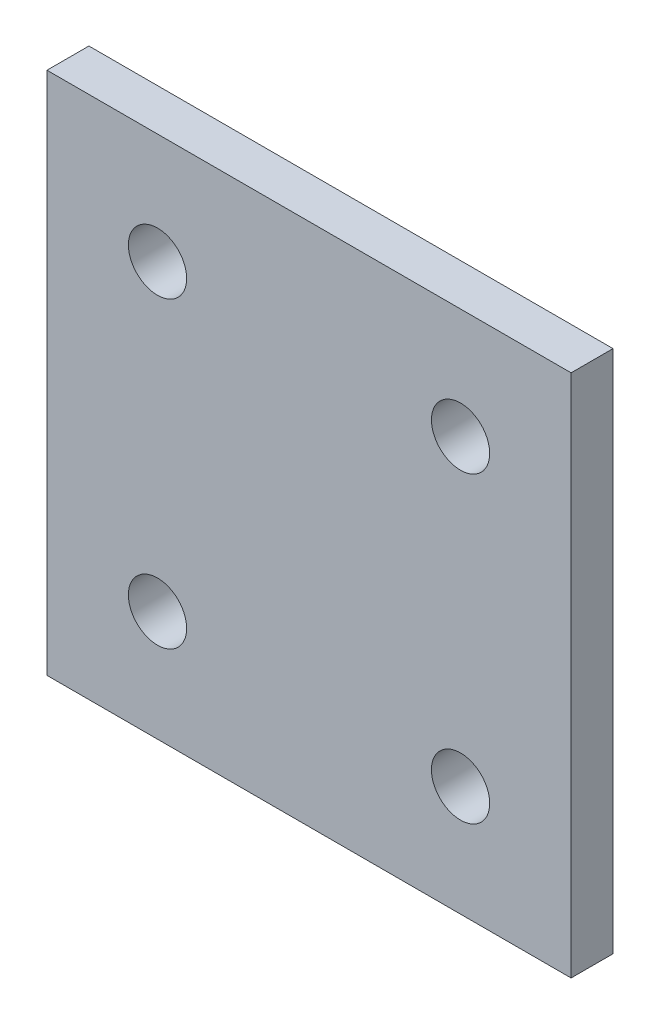
ISO-10303-21;
HEADER;
FILE_DESCRIPTION(('STEP AP214'),'2;1');
FILE_NAME('part.step','',(''),(''),'','','');
FILE_SCHEMA(('AUTOMOTIVE_DESIGN { 1 0 10303 214 1 1 1 1 }'));
ENDSEC;
DATA;
#1=APPLICATION_CONTEXT('core data for automotive mechanical design processes');
#2=APPLICATION_PROTOCOL_DEFINITION('international standard','automotive_design',2000,#1);
#3=PRODUCT_CONTEXT('',#1,'mechanical');
#4=PRODUCT('Part','Part','',(#3));
#5=PRODUCT_RELATED_PRODUCT_CATEGORY('part','',(#4));
#6=PRODUCT_DEFINITION_FORMATION('','',#4);
#7=PRODUCT_DEFINITION_CONTEXT('part definition',#1,'design');
#8=PRODUCT_DEFINITION('design','',#6,#7);
#9=PRODUCT_DEFINITION_SHAPE('','',#8);
#10=(LENGTH_UNIT() NAMED_UNIT(*) SI_UNIT(.MILLI.,.METRE.));
#11=(NAMED_UNIT(*) PLANE_ANGLE_UNIT() SI_UNIT($,.RADIAN.));
#12=(NAMED_UNIT(*) SI_UNIT($,.STERADIAN.) SOLID_ANGLE_UNIT());
#13=UNCERTAINTY_MEASURE_WITH_UNIT(LENGTH_MEASURE(1.E-05),#10,'distance_accuracy_value','');
#14=(GEOMETRIC_REPRESENTATION_CONTEXT(3) GLOBAL_UNCERTAINTY_ASSIGNED_CONTEXT((#13)) GLOBAL_UNIT_ASSIGNED_CONTEXT((#10,
#11,#12)) REPRESENTATION_CONTEXT('',''));
#15=CARTESIAN_POINT('',(0.,0.,0.));
#16=DIRECTION('',(0.,0.,1.));
#17=DIRECTION('',(1.,0.,0.));
#18=AXIS2_PLACEMENT_3D('',#15,#16,#17);
#19=CARTESIAN_POINT('',(0.,0.,0.));
#20=DIRECTION('',(0.,0.,-1.));
#21=DIRECTION('',(-1.,0.,0.));
#22=AXIS2_PLACEMENT_3D('',#19,#20,#21);
#23=PLANE('',#22);
#24=CARTESIAN_POINT('',(16.5221018480518,-16.5221018480521,0.));
#25=DIRECTION('',(0.,0.,1.));
#26=DIRECTION('',(1.,0.,0.));
#27=AXIS2_PLACEMENT_3D('',#24,#25,#26);
#28=CIRCLE('',#27,3.175);
#29=CARTESIAN_POINT('',(19.6971018480518,-16.5221018480521,0.));
#30=VERTEX_POINT('',#29);
#31=EDGE_CURVE('E175',#30,#30,#28,.T.);
#32=ORIENTED_EDGE('',*,*,#31,.T.);
#33=EDGE_LOOP('',(#32));
#34=FACE_BOUND('',#33,.T.);
#35=CARTESIAN_POINT('',(0.,0.,0.));
#36=DIRECTION('',(0.,0.,1.));
#37=DIRECTION('',(1.,0.,0.));
#38=AXIS2_PLACEMENT_3D('',#35,#36,#37);
#39=CIRCLE('',#38,11.3);
#40=CARTESIAN_POINT('',(11.3,0.,0.));
#41=VERTEX_POINT('',#40);
#42=EDGE_CURVE('E181',#41,#41,#39,.T.);
#43=ORIENTED_EDGE('',*,*,#42,.T.);
#44=EDGE_LOOP('',(#43));
#45=FACE_BOUND('',#44,.T.);
#46=DIRECTION('',(0.,1.,0.));
#47=VECTOR('',#46,1.);
#48=CARTESIAN_POINT('',(28.575,-28.575,0.));
#49=LINE('',#48,#47);
#50=CARTESIAN_POINT('',(28.575,-28.575,0.));
#51=VERTEX_POINT('',#50);
#52=CARTESIAN_POINT('',(28.575,28.575,0.));
#53=VERTEX_POINT('',#52);
#54=EDGE_CURVE('E189',#51,#53,#49,.T.);
#55=ORIENTED_EDGE('',*,*,#54,.F.);
#56=DIRECTION('',(1.,0.,0.));
#57=VECTOR('',#56,1.);
#58=CARTESIAN_POINT('',(-28.575,-28.575,0.));
#59=LINE('',#58,#57);
#60=CARTESIAN_POINT('',(-28.575,-28.575,0.));
#61=VERTEX_POINT('',#60);
#62=EDGE_CURVE('E118',#61,#51,#59,.T.);
#63=ORIENTED_EDGE('',*,*,#62,.F.);
#64=DIRECTION('',(0.,-1.,0.));
#65=VECTOR('',#64,1.);
#66=CARTESIAN_POINT('',(-28.575,-28.575,0.));
#67=LINE('',#66,#65);
#68=CARTESIAN_POINT('',(-28.575,28.575,0.));
#69=VERTEX_POINT('',#68);
#70=EDGE_CURVE('E126',#69,#61,#67,.T.);
#71=ORIENTED_EDGE('',*,*,#70,.F.);
#72=DIRECTION('',(-1.,0.,0.));
#73=VECTOR('',#72,1.);
#74=CARTESIAN_POINT('',(-28.575,28.575,0.));
#75=LINE('',#74,#73);
#76=EDGE_CURVE('E147',#53,#69,#75,.T.);
#77=ORIENTED_EDGE('',*,*,#76,.F.);
#78=EDGE_LOOP('',(#55,#63,#71,#77));
#79=FACE_BOUND('',#78,.T.);
#80=CARTESIAN_POINT('',(-16.5221018480519,16.522101848052,0.));
#81=DIRECTION('',(0.,0.,1.));
#82=DIRECTION('',(1.,0.,0.));
#83=AXIS2_PLACEMENT_3D('',#80,#81,#82);
#84=CIRCLE('',#83,3.175);
#85=CARTESIAN_POINT('',(-13.3471018480519,16.522101848052,0.));
#86=VERTEX_POINT('',#85);
#87=EDGE_CURVE('E186',#86,#86,#84,.T.);
#88=ORIENTED_EDGE('',*,*,#87,.T.);
#89=EDGE_LOOP('',(#88));
#90=FACE_BOUND('',#89,.T.);
#91=CARTESIAN_POINT('',(16.522101848052,16.5221018480519,0.));
#92=DIRECTION('',(0.,0.,1.));
#93=DIRECTION('',(1.,0.,0.));
#94=AXIS2_PLACEMENT_3D('',#91,#92,#93);
#95=CIRCLE('',#94,3.175);
#96=CARTESIAN_POINT('',(19.697101848052,16.5221018480519,0.));
#97=VERTEX_POINT('',#96);
#98=EDGE_CURVE('E178',#97,#97,#95,.T.);
#99=ORIENTED_EDGE('',*,*,#98,.T.);
#100=EDGE_LOOP('',(#99));
#101=FACE_BOUND('',#100,.T.);
#102=CARTESIAN_POINT('',(-16.5221018480521,-16.5221018480517,0.));
#103=DIRECTION('',(0.,0.,1.));
#104=DIRECTION('',(1.,0.,0.));
#105=AXIS2_PLACEMENT_3D('',#102,#103,#104);
#106=CIRCLE('',#105,3.175);
#107=CARTESIAN_POINT('',(-13.3471018480521,-16.5221018480517,0.));
#108=VERTEX_POINT('',#107);
#109=EDGE_CURVE('E172',#108,#108,#106,.T.);
#110=ORIENTED_EDGE('',*,*,#109,.T.);
#111=EDGE_LOOP('',(#110));
#112=FACE_BOUND('',#111,.T.);
#113=ADVANCED_FACE('F103',(#34,#45,#79,#90,#101,#112),#23,.T.);
#114=CARTESIAN_POINT('',(28.575,-28.575,2.032));
#115=DIRECTION('',(-1.,0.,0.));
#116=DIRECTION('',(0.,0.,1.));
#117=AXIS2_PLACEMENT_3D('',#114,#115,#116);
#118=PLANE('',#117);
#119=ORIENTED_EDGE('',*,*,#54,.T.);
#120=DIRECTION('',(0.,0.,-1.));
#121=VECTOR('',#120,1.);
#122=CARTESIAN_POINT('',(28.575,28.575,2.032));
#123=LINE('',#122,#121);
#124=CARTESIAN_POINT('',(28.575,28.575,4.572));
#125=VERTEX_POINT('',#124);
#126=EDGE_CURVE('E12',#125,#53,#123,.T.);
#127=ORIENTED_EDGE('',*,*,#126,.F.);
#128=DIRECTION('',(0.,1.,0.));
#129=VECTOR('',#128,1.);
#130=CARTESIAN_POINT('',(28.575,0.,4.572));
#131=LINE('',#130,#129);
#132=CARTESIAN_POINT('',(28.575,-28.575,4.572));
#133=VERTEX_POINT('',#132);
#134=EDGE_CURVE('E157',#133,#125,#131,.T.);
#135=ORIENTED_EDGE('',*,*,#134,.F.);
#136=DIRECTION('',(0.,0.,-1.));
#137=VECTOR('',#136,1.);
#138=CARTESIAN_POINT('',(28.575,-28.575,2.032));
#139=LINE('',#138,#137);
#140=EDGE_CURVE('E195',#133,#51,#139,.T.);
#141=ORIENTED_EDGE('',*,*,#140,.T.);
#142=EDGE_LOOP('',(#119,#127,#135,#141));
#143=FACE_BOUND('',#142,.T.);
#144=ADVANCED_FACE('F105',(#143),#118,.F.);
#145=CARTESIAN_POINT('',(-28.575,28.575,2.032));
#146=DIRECTION('',(0.,-1.,0.));
#147=DIRECTION('',(0.,0.,-1.));
#148=AXIS2_PLACEMENT_3D('',#145,#146,#147);
#149=PLANE('',#148);
#150=ORIENTED_EDGE('',*,*,#76,.T.);
#151=DIRECTION('',(0.,0.,-1.));
#152=VECTOR('',#151,1.);
#153=CARTESIAN_POINT('',(-28.575,28.575,2.032));
#154=LINE('',#153,#152);
#155=CARTESIAN_POINT('',(-28.575,28.575,4.572));
#156=VERTEX_POINT('',#155);
#157=EDGE_CURVE('E111',#156,#69,#154,.T.);
#158=ORIENTED_EDGE('',*,*,#157,.F.);
#159=DIRECTION('',(1.,0.,0.));
#160=VECTOR('',#159,1.);
#161=CARTESIAN_POINT('',(0.,28.575,4.572));
#162=LINE('',#161,#160);
#163=EDGE_CURVE('E146',#156,#125,#162,.T.);
#164=ORIENTED_EDGE('',*,*,#163,.T.);
#165=ORIENTED_EDGE('',*,*,#126,.T.);
#166=EDGE_LOOP('',(#150,#158,#164,#165));
#167=FACE_BOUND('',#166,.T.);
#168=ADVANCED_FACE('F145',(#167),#149,.F.);
#169=CARTESIAN_POINT('',(-28.575,-28.575,2.032));
#170=DIRECTION('',(1.,0.,0.));
#171=DIRECTION('',(0.,0.,-1.));
#172=AXIS2_PLACEMENT_3D('',#169,#170,#171);
#173=PLANE('',#172);
#174=ORIENTED_EDGE('',*,*,#70,.T.);
#175=DIRECTION('',(0.,0.,-1.));
#176=VECTOR('',#175,1.);
#177=CARTESIAN_POINT('',(-28.575,-28.575,2.032));
#178=LINE('',#177,#176);
#179=CARTESIAN_POINT('',(-28.575,-28.575,4.572));
#180=VERTEX_POINT('',#179);
#181=EDGE_CURVE('E149',#180,#61,#178,.T.);
#182=ORIENTED_EDGE('',*,*,#181,.F.);
#183=DIRECTION('',(0.,1.,0.));
#184=VECTOR('',#183,1.);
#185=CARTESIAN_POINT('',(-28.575,0.,4.572));
#186=LINE('',#185,#184);
#187=EDGE_CURVE('E155',#180,#156,#186,.T.);
#188=ORIENTED_EDGE('',*,*,#187,.T.);
#189=ORIENTED_EDGE('',*,*,#157,.T.);
#190=EDGE_LOOP('',(#174,#182,#188,#189));
#191=FACE_BOUND('',#190,.T.);
#192=ADVANCED_FACE('F159',(#191),#173,.F.);
#193=CARTESIAN_POINT('',(-28.575,-28.575,2.032));
#194=DIRECTION('',(0.,1.,0.));
#195=DIRECTION('',(0.,0.,1.));
#196=AXIS2_PLACEMENT_3D('',#193,#194,#195);
#197=PLANE('',#196);
#198=ORIENTED_EDGE('',*,*,#62,.T.);
#199=ORIENTED_EDGE('',*,*,#140,.F.);
#200=DIRECTION('',(1.,0.,0.));
#201=VECTOR('',#200,1.);
#202=CARTESIAN_POINT('',(0.,-28.575,4.572));
#203=LINE('',#202,#201);
#204=EDGE_CURVE('E169',#180,#133,#203,.T.);
#205=ORIENTED_EDGE('',*,*,#204,.F.);
#206=ORIENTED_EDGE('',*,*,#181,.T.);
#207=EDGE_LOOP('',(#198,#199,#205,#206));
#208=FACE_BOUND('',#207,.T.);
#209=ADVANCED_FACE('F197',(#208),#197,.F.);
#210=CARTESIAN_POINT('',(-16.5221018480519,16.522101848052,2.032));
#211=DIRECTION('',(0.,0.,-1.));
#212=DIRECTION('',(-1.,0.,0.));
#213=AXIS2_PLACEMENT_3D('',#210,#211,#212);
#214=CYLINDRICAL_SURFACE('',#213,3.175);
#215=ORIENTED_EDGE('',*,*,#87,.F.);
#216=EDGE_LOOP('',(#215));
#217=FACE_BOUND('',#216,.T.);
#218=CARTESIAN_POINT('',(-16.5221018480519,16.522101848052,4.572));
#219=DIRECTION('',(0.,0.,-1.));
#220=DIRECTION('',(-1.,0.,0.));
#221=AXIS2_PLACEMENT_3D('',#218,#219,#220);
#222=CIRCLE('',#221,3.175);
#223=CARTESIAN_POINT('',(-19.6971018480519,16.522101848052,4.572));
#224=VERTEX_POINT('',#223);
#225=EDGE_CURVE('E161',#224,#224,#222,.T.);
#226=ORIENTED_EDGE('',*,*,#225,.F.);
#227=EDGE_LOOP('',(#226));
#228=FACE_BOUND('',#227,.T.);
#229=ADVANCED_FACE('F215',(#217,#228),#214,.F.);
#230=CARTESIAN_POINT('',(0.,0.,2.032));
#231=DIRECTION('',(0.,0.,-1.));
#232=DIRECTION('',(-1.,0.,0.));
#233=AXIS2_PLACEMENT_3D('',#230,#231,#232);
#234=CYLINDRICAL_SURFACE('',#233,11.3);
#235=CARTESIAN_POINT('',(0.,0.,2.032));
#236=DIRECTION('',(0.,0.,1.));
#237=DIRECTION('',(1.,0.,0.));
#238=AXIS2_PLACEMENT_3D('',#235,#236,#237);
#239=CIRCLE('',#238,11.3);
#240=CARTESIAN_POINT('',(11.3,0.,2.032));
#241=VERTEX_POINT('',#240);
#242=EDGE_CURVE('E171',#241,#241,#239,.T.);
#243=ORIENTED_EDGE('',*,*,#242,.T.);
#244=EDGE_LOOP('',(#243));
#245=FACE_BOUND('',#244,.T.);
#246=ORIENTED_EDGE('',*,*,#42,.F.);
#247=EDGE_LOOP('',(#246));
#248=FACE_BOUND('',#247,.T.);
#249=ADVANCED_FACE('F236',(#245,#248),#234,.F.);
#250=CARTESIAN_POINT('',(16.522101848052,16.5221018480519,2.032));
#251=DIRECTION('',(0.,0.,-1.));
#252=DIRECTION('',(-1.,0.,0.));
#253=AXIS2_PLACEMENT_3D('',#250,#251,#252);
#254=CYLINDRICAL_SURFACE('',#253,3.175);
#255=ORIENTED_EDGE('',*,*,#98,.F.);
#256=EDGE_LOOP('',(#255));
#257=FACE_BOUND('',#256,.T.);
#258=CARTESIAN_POINT('',(16.522101848052,16.5221018480519,4.572));
#259=DIRECTION('',(0.,0.,-1.));
#260=DIRECTION('',(-1.,0.,0.));
#261=AXIS2_PLACEMENT_3D('',#258,#259,#260);
#262=CIRCLE('',#261,3.175);
#263=CARTESIAN_POINT('',(13.347101848052,16.5221018480519,4.572));
#264=VERTEX_POINT('',#263);
#265=EDGE_CURVE('E164',#264,#264,#262,.T.);
#266=ORIENTED_EDGE('',*,*,#265,.F.);
#267=EDGE_LOOP('',(#266));
#268=FACE_BOUND('',#267,.T.);
#269=ADVANCED_FACE('F242',(#257,#268),#254,.F.);
#270=CARTESIAN_POINT('',(16.5221018480518,-16.5221018480521,2.032));
#271=DIRECTION('',(0.,0.,-1.));
#272=DIRECTION('',(-1.,0.,0.));
#273=AXIS2_PLACEMENT_3D('',#270,#271,#272);
#274=CYLINDRICAL_SURFACE('',#273,3.175);
#275=ORIENTED_EDGE('',*,*,#31,.F.);
#276=EDGE_LOOP('',(#275));
#277=FACE_BOUND('',#276,.T.);
#278=CARTESIAN_POINT('',(16.5221018480518,-16.5221018480521,4.572));
#279=DIRECTION('',(0.,0.,-1.));
#280=DIRECTION('',(-1.,0.,0.));
#281=AXIS2_PLACEMENT_3D('',#278,#279,#280);
#282=CIRCLE('',#281,3.175);
#283=CARTESIAN_POINT('',(13.3471018480518,-16.5221018480521,4.572));
#284=VERTEX_POINT('',#283);
#285=EDGE_CURVE('E345',#284,#284,#282,.T.);
#286=ORIENTED_EDGE('',*,*,#285,.F.);
#287=EDGE_LOOP('',(#286));
#288=FACE_BOUND('',#287,.T.);
#289=ADVANCED_FACE('F245',(#277,#288),#274,.F.);
#290=CARTESIAN_POINT('',(-16.5221018480521,-16.5221018480517,2.032));
#291=DIRECTION('',(0.,0.,-1.));
#292=DIRECTION('',(-1.,0.,0.));
#293=AXIS2_PLACEMENT_3D('',#290,#291,#292);
#294=CYLINDRICAL_SURFACE('',#293,3.175);
#295=ORIENTED_EDGE('',*,*,#109,.F.);
#296=EDGE_LOOP('',(#295));
#297=FACE_BOUND('',#296,.T.);
#298=CARTESIAN_POINT('',(-16.5221018480521,-16.5221018480517,4.572));
#299=DIRECTION('',(0.,0.,-1.));
#300=DIRECTION('',(-1.,0.,0.));
#301=AXIS2_PLACEMENT_3D('',#298,#299,#300);
#302=CIRCLE('',#301,3.175);
#303=CARTESIAN_POINT('',(-19.6971018480521,-16.5221018480517,4.572));
#304=VERTEX_POINT('',#303);
#305=EDGE_CURVE('E341',#304,#304,#302,.T.);
#306=ORIENTED_EDGE('',*,*,#305,.F.);
#307=EDGE_LOOP('',(#306));
#308=FACE_BOUND('',#307,.T.);
#309=ADVANCED_FACE('F254',(#297,#308),#294,.F.);
#310=CARTESIAN_POINT('',(0.,0.,2.032));
#311=DIRECTION('',(0.,0.,-1.));
#312=DIRECTION('',(-1.,0.,0.));
#313=AXIS2_PLACEMENT_3D('',#310,#311,#312);
#314=PLANE('',#313);
#315=ORIENTED_EDGE('',*,*,#242,.F.);
#316=EDGE_LOOP('',(#315));
#317=FACE_BOUND('',#316,.T.);
#318=ADVANCED_FACE('F263',(#317),#314,.T.);
#319=CARTESIAN_POINT('',(0.,0.,4.572));
#320=DIRECTION('',(0.,0.,-1.));
#321=DIRECTION('',(-1.,0.,0.));
#322=AXIS2_PLACEMENT_3D('',#319,#320,#321);
#323=PLANE('',#322);
#324=ORIENTED_EDGE('',*,*,#305,.T.);
#325=EDGE_LOOP('',(#324));
#326=FACE_BOUND('',#325,.T.);
#327=ORIENTED_EDGE('',*,*,#285,.T.);
#328=EDGE_LOOP('',(#327));
#329=FACE_BOUND('',#328,.T.);
#330=ORIENTED_EDGE('',*,*,#265,.T.);
#331=EDGE_LOOP('',(#330));
#332=FACE_BOUND('',#331,.T.);
#333=ORIENTED_EDGE('',*,*,#225,.T.);
#334=EDGE_LOOP('',(#333));
#335=FACE_BOUND('',#334,.T.);
#336=ORIENTED_EDGE('',*,*,#187,.F.);
#337=ORIENTED_EDGE('',*,*,#204,.T.);
#338=ORIENTED_EDGE('',*,*,#134,.T.);
#339=ORIENTED_EDGE('',*,*,#163,.F.);
#340=EDGE_LOOP('',(#336,#337,#338,#339));
#341=FACE_BOUND('',#340,.T.);
#342=ADVANCED_FACE('F153',(#326,#329,#332,#335,#341),#323,.F.);
#343=CLOSED_SHELL('',(#113,#144,#168,#192,#209,#229,#249,#269,#289,#309,#318,#342));
#344=MANIFOLD_SOLID_BREP('B2',#343);
#345=ADVANCED_BREP_SHAPE_REPRESENTATION('',(#18,#344),#14);
#346=SHAPE_DEFINITION_REPRESENTATION(#9,#345);
ENDSEC;
END-ISO-10303-21;
